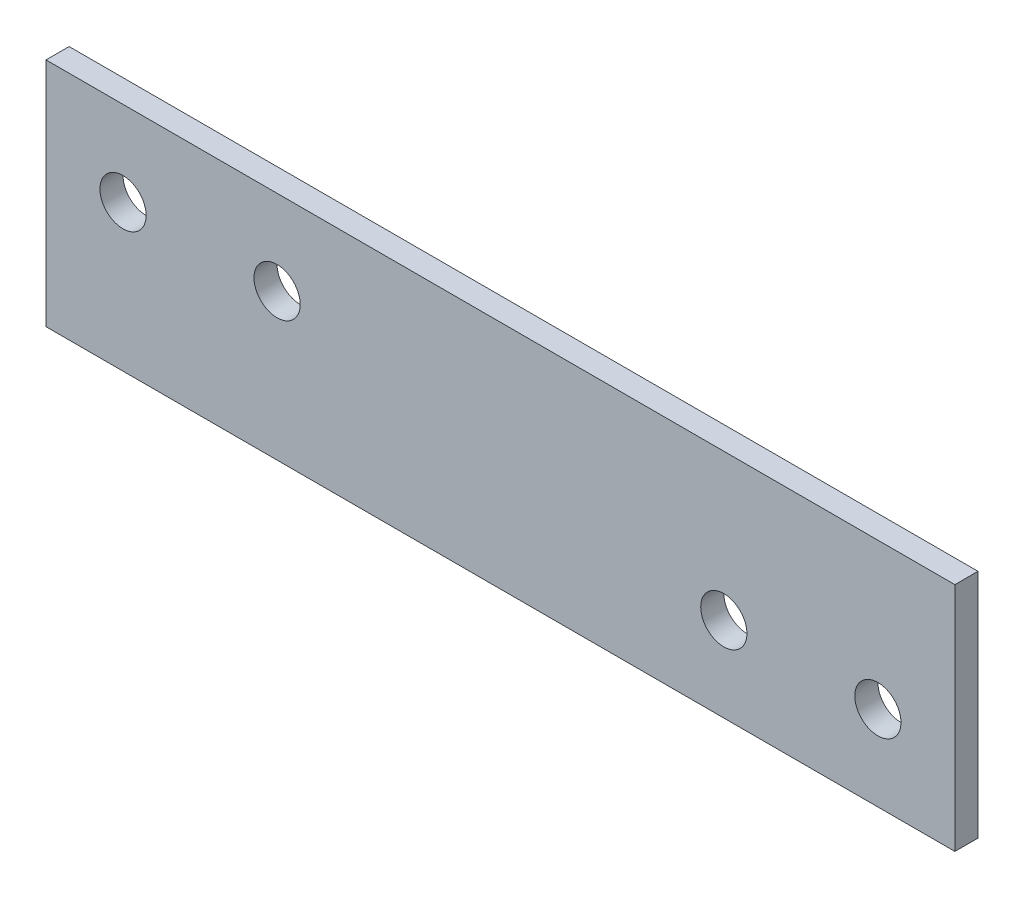
ISO-10303-21;
HEADER;
FILE_DESCRIPTION(('STEP AP214'),'2;1');
FILE_NAME('part.step','',(''),(''),'','','');
FILE_SCHEMA(('AUTOMOTIVE_DESIGN { 1 0 10303 214 1 1 1 1 }'));
ENDSEC;
DATA;
#1=APPLICATION_CONTEXT('core data for automotive mechanical design processes');
#2=APPLICATION_PROTOCOL_DEFINITION('international standard','automotive_design',2000,#1);
#3=PRODUCT_CONTEXT('',#1,'mechanical');
#4=PRODUCT('Part','Part','',(#3));
#5=PRODUCT_RELATED_PRODUCT_CATEGORY('part','',(#4));
#6=PRODUCT_DEFINITION_FORMATION('','',#4);
#7=PRODUCT_DEFINITION_CONTEXT('part definition',#1,'design');
#8=PRODUCT_DEFINITION('design','',#6,#7);
#9=PRODUCT_DEFINITION_SHAPE('','',#8);
#10=(LENGTH_UNIT() NAMED_UNIT(*) SI_UNIT(.MILLI.,.METRE.));
#11=(NAMED_UNIT(*) PLANE_ANGLE_UNIT() SI_UNIT($,.RADIAN.));
#12=(NAMED_UNIT(*) SI_UNIT($,.STERADIAN.) SOLID_ANGLE_UNIT());
#13=UNCERTAINTY_MEASURE_WITH_UNIT(LENGTH_MEASURE(1.E-05),#10,'distance_accuracy_value','');
#14=(GEOMETRIC_REPRESENTATION_CONTEXT(3) GLOBAL_UNCERTAINTY_ASSIGNED_CONTEXT((#13)) GLOBAL_UNIT_ASSIGNED_CONTEXT((#10,
#11,#12)) REPRESENTATION_CONTEXT('',''));
#15=CARTESIAN_POINT('',(0.,0.,0.));
#16=DIRECTION('',(0.,0.,1.));
#17=DIRECTION('',(1.,0.,0.));
#18=AXIS2_PLACEMENT_3D('',#15,#16,#17);
#19=CARTESIAN_POINT('',(-22.2042126956252,12.0449473684211,1.5));
#20=DIRECTION('',(1.,0.,0.));
#21=DIRECTION('',(0.,1.,0.));
#22=AXIS2_PLACEMENT_3D('',#19,#20,#21);
#23=PLANE('',#22);
#24=DIRECTION('',(0.,-1.,0.));
#25=VECTOR('',#24,1.);
#26=CARTESIAN_POINT('',(-22.2042126956252,12.0449473684211,0.));
#27=LINE('',#26,#25);
#28=CARTESIAN_POINT('',(-22.2042126956252,12.0449473684211,0.));
#29=VERTEX_POINT('',#28);
#30=CARTESIAN_POINT('',(-22.2042126956252,-2.95505263157894,0.));
#31=VERTEX_POINT('',#30);
#32=EDGE_CURVE('E94',#29,#31,#27,.T.);
#33=ORIENTED_EDGE('',*,*,#32,.T.);
#34=DIRECTION('',(0.,0.,-1.));
#35=VECTOR('',#34,1.);
#36=CARTESIAN_POINT('',(-22.2042126956252,-2.95505263157894,1.5));
#37=LINE('',#36,#35);
#38=CARTESIAN_POINT('',(-22.2042126956252,-2.95505263157894,1.5));
#39=VERTEX_POINT('',#38);
#40=EDGE_CURVE('E11',#39,#31,#37,.T.);
#41=ORIENTED_EDGE('',*,*,#40,.F.);
#42=DIRECTION('',(0.,-1.,0.));
#43=VECTOR('',#42,1.);
#44=CARTESIAN_POINT('',(-22.2042126956252,12.0449473684211,1.5));
#45=LINE('',#44,#43);
#46=CARTESIAN_POINT('',(-22.2042126956252,12.0449473684211,1.5));
#47=VERTEX_POINT('',#46);
#48=EDGE_CURVE('E82',#47,#39,#45,.T.);
#49=ORIENTED_EDGE('',*,*,#48,.F.);
#50=DIRECTION('',(0.,0.,-1.));
#51=VECTOR('',#50,1.);
#52=CARTESIAN_POINT('',(-22.2042126956252,12.0449473684211,1.5));
#53=LINE('',#52,#51);
#54=EDGE_CURVE('E90',#47,#29,#53,.T.);
#55=ORIENTED_EDGE('',*,*,#54,.T.);
#56=EDGE_LOOP('',(#33,#41,#49,#55));
#57=FACE_BOUND('',#56,.T.);
#58=ADVANCED_FACE('F31',(#57),#23,.F.);
#59=CARTESIAN_POINT('',(-22.2042126956252,-2.95505263157894,1.5));
#60=DIRECTION('',(0.,1.,0.));
#61=DIRECTION('',(0.,0.,1.));
#62=AXIS2_PLACEMENT_3D('',#59,#60,#61);
#63=PLANE('',#62);
#64=DIRECTION('',(1.,0.,0.));
#65=VECTOR('',#64,1.);
#66=CARTESIAN_POINT('',(-22.2042126956252,-2.95505263157894,0.));
#67=LINE('',#66,#65);
#68=CARTESIAN_POINT('',(36.7957873043748,-2.95505263157894,0.));
#69=VERTEX_POINT('',#68);
#70=EDGE_CURVE('E86',#31,#69,#67,.T.);
#71=ORIENTED_EDGE('',*,*,#70,.T.);
#72=DIRECTION('',(0.,0.,-1.));
#73=VECTOR('',#72,1.);
#74=CARTESIAN_POINT('',(36.7957873043748,-2.95505263157894,1.5));
#75=LINE('',#74,#73);
#76=CARTESIAN_POINT('',(36.7957873043748,-2.95505263157894,1.5));
#77=VERTEX_POINT('',#76);
#78=EDGE_CURVE('E39',#77,#69,#75,.T.);
#79=ORIENTED_EDGE('',*,*,#78,.F.);
#80=DIRECTION('',(1.,0.,0.));
#81=VECTOR('',#80,1.);
#82=CARTESIAN_POINT('',(-22.2042126956252,-2.95505263157894,1.5));
#83=LINE('',#82,#81);
#84=EDGE_CURVE('E77',#39,#77,#83,.T.);
#85=ORIENTED_EDGE('',*,*,#84,.F.);
#86=ORIENTED_EDGE('',*,*,#40,.T.);
#87=EDGE_LOOP('',(#71,#79,#85,#86));
#88=FACE_BOUND('',#87,.T.);
#89=ADVANCED_FACE('F85',(#88),#63,.F.);
#90=CARTESIAN_POINT('',(36.7957873043748,12.0449473684211,1.5));
#91=DIRECTION('',(-1.,0.,0.));
#92=DIRECTION('',(0.,0.,1.));
#93=AXIS2_PLACEMENT_3D('',#90,#91,#92);
#94=PLANE('',#93);
#95=DIRECTION('',(0.,1.,0.));
#96=VECTOR('',#95,1.);
#97=CARTESIAN_POINT('',(36.7957873043748,12.0449473684211,0.));
#98=LINE('',#97,#96);
#99=CARTESIAN_POINT('',(36.7957873043748,12.0449473684211,0.));
#100=VERTEX_POINT('',#99);
#101=EDGE_CURVE('E64',#69,#100,#98,.T.);
#102=ORIENTED_EDGE('',*,*,#101,.T.);
#103=DIRECTION('',(0.,0.,-1.));
#104=VECTOR('',#103,1.);
#105=CARTESIAN_POINT('',(36.7957873043748,12.0449473684211,1.5));
#106=LINE('',#105,#104);
#107=CARTESIAN_POINT('',(36.7957873043748,12.0449473684211,1.5));
#108=VERTEX_POINT('',#107);
#109=EDGE_CURVE('E87',#108,#100,#106,.T.);
#110=ORIENTED_EDGE('',*,*,#109,.F.);
#111=DIRECTION('',(0.,1.,0.));
#112=VECTOR('',#111,1.);
#113=CARTESIAN_POINT('',(36.7957873043748,12.0449473684211,1.5));
#114=LINE('',#113,#112);
#115=EDGE_CURVE('E80',#77,#108,#114,.T.);
#116=ORIENTED_EDGE('',*,*,#115,.F.);
#117=ORIENTED_EDGE('',*,*,#78,.T.);
#118=EDGE_LOOP('',(#102,#110,#116,#117));
#119=FACE_BOUND('',#118,.T.);
#120=ADVANCED_FACE('F88',(#119),#94,.F.);
#121=CARTESIAN_POINT('',(-22.2042126956252,12.0449473684211,1.5));
#122=DIRECTION('',(0.,-1.,0.));
#123=DIRECTION('',(0.,0.,-1.));
#124=AXIS2_PLACEMENT_3D('',#121,#122,#123);
#125=PLANE('',#124);
#126=DIRECTION('',(-1.,0.,0.));
#127=VECTOR('',#126,1.);
#128=CARTESIAN_POINT('',(-22.2042126956252,12.0449473684211,0.));
#129=LINE('',#128,#127);
#130=EDGE_CURVE('E70',#100,#29,#129,.T.);
#131=ORIENTED_EDGE('',*,*,#130,.T.);
#132=ORIENTED_EDGE('',*,*,#54,.F.);
#133=DIRECTION('',(-1.,0.,0.));
#134=VECTOR('',#133,1.);
#135=CARTESIAN_POINT('',(-22.2042126956252,12.0449473684211,1.5));
#136=LINE('',#135,#134);
#137=EDGE_CURVE('E47',#108,#47,#136,.T.);
#138=ORIENTED_EDGE('',*,*,#137,.F.);
#139=ORIENTED_EDGE('',*,*,#109,.T.);
#140=EDGE_LOOP('',(#131,#132,#138,#139));
#141=FACE_BOUND('',#140,.T.);
#142=ADVANCED_FACE('F102',(#141),#125,.F.);
#143=CARTESIAN_POINT('',(-22.2042126956252,-2.95505263157894,1.5));
#144=DIRECTION('',(0.,0.,1.));
#145=DIRECTION('',(1.,0.,0.));
#146=AXIS2_PLACEMENT_3D('',#143,#144,#145);
#147=PLANE('',#146);
#148=CARTESIAN_POINT('',(-7.20421269562522,6.54494736842106,1.5));
#149=DIRECTION('',(0.,0.,-1.));
#150=DIRECTION('',(-1.,0.,0.));
#151=AXIS2_PLACEMENT_3D('',#148,#149,#150);
#152=CIRCLE('',#151,1.5);
#153=CARTESIAN_POINT('',(-8.70421269562522,6.54494736842106,1.5));
#154=VERTEX_POINT('',#153);
#155=EDGE_CURVE('E123',#154,#154,#152,.T.);
#156=ORIENTED_EDGE('',*,*,#155,.T.);
#157=EDGE_LOOP('',(#156));
#158=FACE_BOUND('',#157,.T.);
#159=CARTESIAN_POINT('',(-17.2042126956252,6.54494736842106,1.5));
#160=DIRECTION('',(0.,0.,-1.));
#161=DIRECTION('',(-1.,0.,0.));
#162=AXIS2_PLACEMENT_3D('',#159,#160,#161);
#163=CIRCLE('',#162,1.5);
#164=CARTESIAN_POINT('',(-18.7042126956252,6.54494736842106,1.5));
#165=VERTEX_POINT('',#164);
#166=EDGE_CURVE('E117',#165,#165,#163,.T.);
#167=ORIENTED_EDGE('',*,*,#166,.T.);
#168=EDGE_LOOP('',(#167));
#169=FACE_BOUND('',#168,.T.);
#170=CARTESIAN_POINT('',(21.7957873043748,2.54494736842106,1.5));
#171=DIRECTION('',(0.,0.,-1.));
#172=DIRECTION('',(-1.,0.,0.));
#173=AXIS2_PLACEMENT_3D('',#170,#171,#172);
#174=CIRCLE('',#173,1.5);
#175=CARTESIAN_POINT('',(20.2957873043748,2.54494736842106,1.5));
#176=VERTEX_POINT('',#175);
#177=EDGE_CURVE('E111',#176,#176,#174,.T.);
#178=ORIENTED_EDGE('',*,*,#177,.T.);
#179=EDGE_LOOP('',(#178));
#180=FACE_BOUND('',#179,.T.);
#181=CARTESIAN_POINT('',(31.7957873043748,2.54494736842106,1.5));
#182=DIRECTION('',(0.,0.,-1.));
#183=DIRECTION('',(-1.,0.,0.));
#184=AXIS2_PLACEMENT_3D('',#181,#182,#183);
#185=CIRCLE('',#184,1.5);
#186=CARTESIAN_POINT('',(30.2957873043748,2.54494736842106,1.5));
#187=VERTEX_POINT('',#186);
#188=EDGE_CURVE('E97',#187,#187,#185,.T.);
#189=ORIENTED_EDGE('',*,*,#188,.T.);
#190=EDGE_LOOP('',(#189));
#191=FACE_BOUND('',#190,.T.);
#192=ORIENTED_EDGE('',*,*,#48,.T.);
#193=ORIENTED_EDGE('',*,*,#84,.T.);
#194=ORIENTED_EDGE('',*,*,#115,.T.);
#195=ORIENTED_EDGE('',*,*,#137,.T.);
#196=EDGE_LOOP('',(#192,#193,#194,#195));
#197=FACE_BOUND('',#196,.T.);
#198=ADVANCED_FACE('F78',(#158,#169,#180,#191,#197),#147,.T.);
#199=CARTESIAN_POINT('',(-22.2042126956252,-2.95505263157894,0.));
#200=DIRECTION('',(0.,0.,1.));
#201=DIRECTION('',(1.,0.,0.));
#202=AXIS2_PLACEMENT_3D('',#199,#200,#201);
#203=PLANE('',#202);
#204=CARTESIAN_POINT('',(-7.20421269562522,6.54494736842106,0.));
#205=DIRECTION('',(0.,0.,-1.));
#206=DIRECTION('',(-1.,0.,0.));
#207=AXIS2_PLACEMENT_3D('',#204,#205,#206);
#208=CIRCLE('',#207,1.5);
#209=CARTESIAN_POINT('',(-8.70421269562522,6.54494736842106,0.));
#210=VERTEX_POINT('',#209);
#211=EDGE_CURVE('E126',#210,#210,#208,.T.);
#212=ORIENTED_EDGE('',*,*,#211,.F.);
#213=EDGE_LOOP('',(#212));
#214=FACE_BOUND('',#213,.T.);
#215=CARTESIAN_POINT('',(-17.2042126956252,6.54494736842106,0.));
#216=DIRECTION('',(0.,0.,-1.));
#217=DIRECTION('',(-1.,0.,0.));
#218=AXIS2_PLACEMENT_3D('',#215,#216,#217);
#219=CIRCLE('',#218,1.5);
#220=CARTESIAN_POINT('',(-18.7042126956252,6.54494736842106,0.));
#221=VERTEX_POINT('',#220);
#222=EDGE_CURVE('E120',#221,#221,#219,.T.);
#223=ORIENTED_EDGE('',*,*,#222,.F.);
#224=EDGE_LOOP('',(#223));
#225=FACE_BOUND('',#224,.T.);
#226=CARTESIAN_POINT('',(21.7957873043748,2.54494736842106,0.));
#227=DIRECTION('',(0.,0.,-1.));
#228=DIRECTION('',(-1.,0.,0.));
#229=AXIS2_PLACEMENT_3D('',#226,#227,#228);
#230=CIRCLE('',#229,1.5);
#231=CARTESIAN_POINT('',(20.2957873043748,2.54494736842106,0.));
#232=VERTEX_POINT('',#231);
#233=EDGE_CURVE('E114',#232,#232,#230,.T.);
#234=ORIENTED_EDGE('',*,*,#233,.F.);
#235=EDGE_LOOP('',(#234));
#236=FACE_BOUND('',#235,.T.);
#237=CARTESIAN_POINT('',(31.7957873043748,2.54494736842106,0.));
#238=DIRECTION('',(0.,0.,-1.));
#239=DIRECTION('',(-1.,0.,0.));
#240=AXIS2_PLACEMENT_3D('',#237,#238,#239);
#241=CIRCLE('',#240,1.5);
#242=CARTESIAN_POINT('',(30.2957873043748,2.54494736842106,0.));
#243=VERTEX_POINT('',#242);
#244=EDGE_CURVE('E108',#243,#243,#241,.T.);
#245=ORIENTED_EDGE('',*,*,#244,.F.);
#246=EDGE_LOOP('',(#245));
#247=FACE_BOUND('',#246,.T.);
#248=ORIENTED_EDGE('',*,*,#32,.F.);
#249=ORIENTED_EDGE('',*,*,#130,.F.);
#250=ORIENTED_EDGE('',*,*,#101,.F.);
#251=ORIENTED_EDGE('',*,*,#70,.F.);
#252=EDGE_LOOP('',(#248,#249,#250,#251));
#253=FACE_BOUND('',#252,.T.);
#254=ADVANCED_FACE('F105',(#214,#225,#236,#247,#253),#203,.F.);
#255=CARTESIAN_POINT('',(31.7957873043748,2.54494736842106,1.5));
#256=DIRECTION('',(0.,0.,-1.));
#257=DIRECTION('',(-1.,0.,0.));
#258=AXIS2_PLACEMENT_3D('',#255,#256,#257);
#259=CYLINDRICAL_SURFACE('',#258,1.5);
#260=ORIENTED_EDGE('',*,*,#188,.F.);
#261=EDGE_LOOP('',(#260));
#262=FACE_BOUND('',#261,.T.);
#263=ORIENTED_EDGE('',*,*,#244,.T.);
#264=EDGE_LOOP('',(#263));
#265=FACE_BOUND('',#264,.T.);
#266=ADVANCED_FACE('F143',(#262,#265),#259,.F.);
#267=CARTESIAN_POINT('',(21.7957873043748,2.54494736842106,1.5));
#268=DIRECTION('',(0.,0.,-1.));
#269=DIRECTION('',(-1.,0.,0.));
#270=AXIS2_PLACEMENT_3D('',#267,#268,#269);
#271=CYLINDRICAL_SURFACE('',#270,1.5);
#272=ORIENTED_EDGE('',*,*,#177,.F.);
#273=EDGE_LOOP('',(#272));
#274=FACE_BOUND('',#273,.T.);
#275=ORIENTED_EDGE('',*,*,#233,.T.);
#276=EDGE_LOOP('',(#275));
#277=FACE_BOUND('',#276,.T.);
#278=ADVANCED_FACE('F152',(#274,#277),#271,.F.);
#279=CARTESIAN_POINT('',(-17.2042126956252,6.54494736842106,1.5));
#280=DIRECTION('',(0.,0.,-1.));
#281=DIRECTION('',(-1.,0.,0.));
#282=AXIS2_PLACEMENT_3D('',#279,#280,#281);
#283=CYLINDRICAL_SURFACE('',#282,1.5);
#284=ORIENTED_EDGE('',*,*,#166,.F.);
#285=EDGE_LOOP('',(#284));
#286=FACE_BOUND('',#285,.T.);
#287=ORIENTED_EDGE('',*,*,#222,.T.);
#288=EDGE_LOOP('',(#287));
#289=FACE_BOUND('',#288,.T.);
#290=ADVANCED_FACE('F137',(#286,#289),#283,.F.);
#291=CARTESIAN_POINT('',(-7.20421269562522,6.54494736842106,1.5));
#292=DIRECTION('',(0.,0.,-1.));
#293=DIRECTION('',(-1.,0.,0.));
#294=AXIS2_PLACEMENT_3D('',#291,#292,#293);
#295=CYLINDRICAL_SURFACE('',#294,1.5);
#296=ORIENTED_EDGE('',*,*,#155,.F.);
#297=EDGE_LOOP('',(#296));
#298=FACE_BOUND('',#297,.T.);
#299=ORIENTED_EDGE('',*,*,#211,.T.);
#300=EDGE_LOOP('',(#299));
#301=FACE_BOUND('',#300,.T.);
#302=ADVANCED_FACE('F134',(#298,#301),#295,.F.);
#303=CLOSED_SHELL('',(#58,#89,#120,#142,#198,#254,#266,#278,#290,#302));
#304=MANIFOLD_SOLID_BREP('B2',#303);
#305=ADVANCED_BREP_SHAPE_REPRESENTATION('',(#18,#304),#14);
#306=SHAPE_DEFINITION_REPRESENTATION(#9,#305);
ENDSEC;
END-ISO-10303-21;
